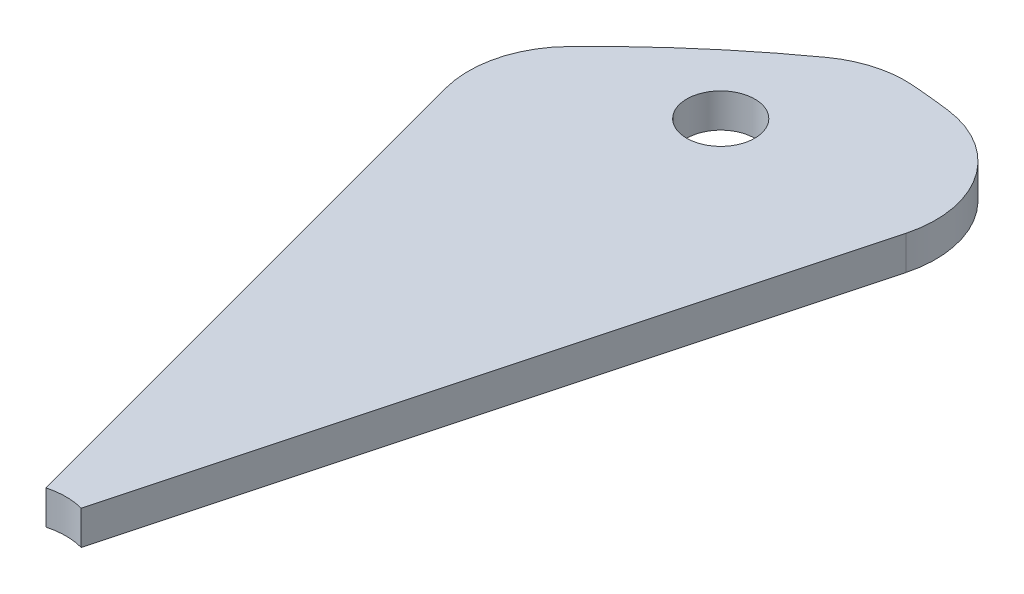
ISO-10303-21;
HEADER;
FILE_DESCRIPTION(('STEP AP214'),'2;1');
FILE_NAME('part.step','',(''),(''),'','','');
FILE_SCHEMA(('AUTOMOTIVE_DESIGN { 1 0 10303 214 1 1 1 1 }'));
ENDSEC;
DATA;
#1=APPLICATION_CONTEXT('core data for automotive mechanical design processes');
#2=APPLICATION_PROTOCOL_DEFINITION('international standard','automotive_design',2000,#1);
#3=PRODUCT_CONTEXT('',#1,'mechanical');
#4=PRODUCT('Part','Part','',(#3));
#5=PRODUCT_RELATED_PRODUCT_CATEGORY('part','',(#4));
#6=PRODUCT_DEFINITION_FORMATION('','',#4);
#7=PRODUCT_DEFINITION_CONTEXT('part definition',#1,'design');
#8=PRODUCT_DEFINITION('design','',#6,#7);
#9=PRODUCT_DEFINITION_SHAPE('','',#8);
#10=(LENGTH_UNIT() NAMED_UNIT(*) SI_UNIT(.MILLI.,.METRE.));
#11=(NAMED_UNIT(*) PLANE_ANGLE_UNIT() SI_UNIT($,.RADIAN.));
#12=(NAMED_UNIT(*) SI_UNIT($,.STERADIAN.) SOLID_ANGLE_UNIT());
#13=UNCERTAINTY_MEASURE_WITH_UNIT(LENGTH_MEASURE(1.E-05),#10,'distance_accuracy_value','');
#14=(GEOMETRIC_REPRESENTATION_CONTEXT(3) GLOBAL_UNCERTAINTY_ASSIGNED_CONTEXT((#13)) GLOBAL_UNIT_ASSIGNED_CONTEXT((#10,
#11,#12)) REPRESENTATION_CONTEXT('',''));
#15=CARTESIAN_POINT('',(0.,0.,0.));
#16=DIRECTION('',(0.,0.,1.));
#17=DIRECTION('',(1.,0.,0.));
#18=AXIS2_PLACEMENT_3D('',#15,#16,#17);
#19=CARTESIAN_POINT('',(0.,0.,0.));
#20=DIRECTION('',(0.,1.,0.));
#21=DIRECTION('',(0.,0.,1.));
#22=AXIS2_PLACEMENT_3D('',#19,#20,#21);
#23=PLANE('',#22);
#24=CARTESIAN_POINT('',(0.,0.,0.));
#25=DIRECTION('',(0.,1.,0.));
#26=DIRECTION('',(0.,0.,1.));
#27=AXIS2_PLACEMENT_3D('',#24,#25,#26);
#28=CIRCLE('',#27,50.);
#29=CARTESIAN_POINT('',(6.23421098286529,0.,-49.6098237592226));
#30=VERTEX_POINT('',#29);
#31=CARTESIAN_POINT('',(3.97727272727275,0.,-49.8415619905004));
#32=VERTEX_POINT('',#31);
#33=EDGE_CURVE('E184',#30,#32,#28,.T.);
#34=ORIENTED_EDGE('',*,*,#33,.F.);
#35=CARTESIAN_POINT('',(5.48610566492146,0.,-43.6566449081159));
#36=DIRECTION('',(0.,1.,0.));
#37=DIRECTION('',(0.,0.,1.));
#38=AXIS2_PLACEMENT_3D('',#35,#36,#37);
#39=CIRCLE('',#38,6.);
#40=CARTESIAN_POINT('',(11.2816606226559,0.,-42.1037306375007));
#41=VERTEX_POINT('',#40);
#42=EDGE_CURVE('E201',#30,#41,#39,.F.);
#43=ORIENTED_EDGE('',*,*,#42,.T.);
#44=DIRECTION('',(0.258819045102521,0.,-0.965925826289068));
#45=VECTOR('',#44,1.);
#46=CARTESIAN_POINT('',(0.,0.,0.));
#47=LINE('',#46,#45);
#48=CARTESIAN_POINT('',(1.03527618041009,0.,-3.86370330515627));
#49=VERTEX_POINT('',#48);
#50=EDGE_CURVE('E181',#49,#41,#47,.T.);
#51=ORIENTED_EDGE('',*,*,#50,.F.);
#52=CARTESIAN_POINT('',(0.,0.,0.));
#53=DIRECTION('',(0.,1.,0.));
#54=DIRECTION('',(0.,0.,1.));
#55=AXIS2_PLACEMENT_3D('',#52,#53,#54);
#56=CIRCLE('',#55,4.);
#57=CARTESIAN_POINT('',(-1.03527618041009,0.,-3.86370330515627));
#58=VERTEX_POINT('',#57);
#59=EDGE_CURVE('E178',#49,#58,#56,.T.);
#60=ORIENTED_EDGE('',*,*,#59,.T.);
#61=DIRECTION('',(-0.258819045102521,0.,-0.965925826289068));
#62=VECTOR('',#61,1.);
#63=CARTESIAN_POINT('',(0.,0.,0.));
#64=LINE('',#63,#62);
#65=CARTESIAN_POINT('',(-9.63613395733424,0.,-35.9625415173111));
#66=VERTEX_POINT('',#65);
#67=EDGE_CURVE('E163',#58,#66,#64,.T.);
#68=ORIENTED_EDGE('',*,*,#67,.T.);
#69=CARTESIAN_POINT('',(-3.84057899959983,0.,-37.5154557879262));
#70=DIRECTION('',(0.,1.,0.));
#71=DIRECTION('',(0.,0.,1.));
#72=AXIS2_PLACEMENT_3D('',#69,#70,#71);
#73=CIRCLE('',#72,6.);
#74=CARTESIAN_POINT('',(-8.15619888844427,0.,-41.6838397643624));
#75=VERTEX_POINT('',#74);
#76=EDGE_CURVE('E197',#66,#75,#73,.F.);
#77=ORIENTED_EDGE('',*,*,#76,.T.);
#78=CARTESIAN_POINT('',(35.,0.,0.));
#79=DIRECTION('',(0.,1.,0.));
#80=DIRECTION('',(0.,0.,1.));
#81=AXIS2_PLACEMENT_3D('',#78,#79,#80);
#82=CIRCLE('',#81,60.);
#83=CARTESIAN_POINT('',(0.,0.,-48.7339717240448));
#84=VERTEX_POINT('',#83);
#85=EDGE_CURVE('E150',#84,#75,#82,.T.);
#86=ORIENTED_EDGE('',*,*,#85,.F.);
#87=CARTESIAN_POINT('',(3.50000000000002,0.,-43.8605745516403));
#88=DIRECTION('',(0.,1.,0.));
#89=DIRECTION('',(0.,0.,1.));
#90=AXIS2_PLACEMENT_3D('',#87,#88,#89);
#91=CIRCLE('',#90,6.);
#92=EDGE_CURVE('E199',#84,#32,#91,.F.);
#93=ORIENTED_EDGE('',*,*,#92,.T.);
#94=EDGE_LOOP('',(#34,#43,#51,#60,#68,#77,#86,#93));
#95=FACE_BOUND('',#94,.T.);
#96=CARTESIAN_POINT('',(0.,0.,-42.5));
#97=DIRECTION('',(0.,1.,0.));
#98=DIRECTION('',(0.,0.,1.));
#99=AXIS2_PLACEMENT_3D('',#96,#97,#98);
#100=CIRCLE('',#99,2.);
#101=CARTESIAN_POINT('',(0.,0.,-40.5));
#102=VERTEX_POINT('',#101);
#103=EDGE_CURVE('E157',#102,#102,#100,.T.);
#104=ORIENTED_EDGE('',*,*,#103,.T.);
#105=EDGE_LOOP('',(#104));
#106=FACE_BOUND('',#105,.T.);
#107=CARTESIAN_POINT('',(-1.5,0.,-38.));
#108=DIRECTION('',(0.,-1.,0.));
#109=DIRECTION('',(0.,0.,-1.));
#110=AXIS2_PLACEMENT_3D('',#107,#108,#109);
#111=CIRCLE('',#110,0.5);
#112=CARTESIAN_POINT('',(-1.5,0.,-37.5));
#113=VERTEX_POINT('',#112);
#114=CARTESIAN_POINT('',(-1.5,0.,-38.5));
#115=VERTEX_POINT('',#114);
#116=EDGE_CURVE('E146',#113,#115,#111,.T.);
#117=ORIENTED_EDGE('',*,*,#116,.F.);
#118=DIRECTION('',(-1.,0.,0.));
#119=VECTOR('',#118,1.);
#120=CARTESIAN_POINT('',(-1.5,0.,-37.5));
#121=LINE('',#120,#119);
#122=CARTESIAN_POINT('',(1.5,0.,-37.5));
#123=VERTEX_POINT('',#122);
#124=EDGE_CURVE('E143',#123,#113,#121,.T.);
#125=ORIENTED_EDGE('',*,*,#124,.F.);
#126=CARTESIAN_POINT('',(1.5,0.,-38.));
#127=DIRECTION('',(0.,-1.,0.));
#128=DIRECTION('',(0.,0.,-1.));
#129=AXIS2_PLACEMENT_3D('',#126,#127,#128);
#130=CIRCLE('',#129,0.5);
#131=CARTESIAN_POINT('',(1.5,0.,-38.5));
#132=VERTEX_POINT('',#131);
#133=EDGE_CURVE('E57',#132,#123,#130,.T.);
#134=ORIENTED_EDGE('',*,*,#133,.F.);
#135=DIRECTION('',(1.,0.,0.));
#136=VECTOR('',#135,1.);
#137=CARTESIAN_POINT('',(-1.5,0.,-38.5));
#138=LINE('',#137,#136);
#139=EDGE_CURVE('E52',#115,#132,#138,.T.);
#140=ORIENTED_EDGE('',*,*,#139,.F.);
#141=EDGE_LOOP('',(#117,#125,#134,#140));
#142=FACE_BOUND('',#141,.T.);
#143=ADVANCED_FACE('F37',(#95,#106,#142),#23,.F.);
#144=CARTESIAN_POINT('',(0.,2.,0.));
#145=DIRECTION('',(0.,-1.,0.));
#146=DIRECTION('',(0.,0.,-1.));
#147=AXIS2_PLACEMENT_3D('',#144,#145,#146);
#148=CYLINDRICAL_SURFACE('',#147,50.);
#149=CARTESIAN_POINT('',(0.,2.,0.));
#150=DIRECTION('',(0.,1.,0.));
#151=DIRECTION('',(0.,0.,1.));
#152=AXIS2_PLACEMENT_3D('',#149,#150,#151);
#153=CIRCLE('',#152,50.);
#154=CARTESIAN_POINT('',(6.23421098286529,2.,-49.6098237592226));
#155=VERTEX_POINT('',#154);
#156=CARTESIAN_POINT('',(3.97727272727275,2.,-49.8415619905004));
#157=VERTEX_POINT('',#156);
#158=EDGE_CURVE('E169',#155,#157,#153,.T.);
#159=ORIENTED_EDGE('',*,*,#158,.F.);
#160=DIRECTION('',(0.,-1.,0.));
#161=VECTOR('',#160,1.);
#162=CARTESIAN_POINT('',(6.23421098286529,2.,-49.6098237592226));
#163=LINE('',#162,#161);
#164=EDGE_CURVE('E194',#155,#30,#163,.T.);
#165=ORIENTED_EDGE('',*,*,#164,.T.);
#166=ORIENTED_EDGE('',*,*,#33,.T.);
#167=DIRECTION('',(0.,-1.,0.));
#168=VECTOR('',#167,1.);
#169=CARTESIAN_POINT('',(3.97727272727275,2.,-49.8415619905004));
#170=LINE('',#169,#168);
#171=EDGE_CURVE('E192',#32,#157,#170,.F.);
#172=ORIENTED_EDGE('',*,*,#171,.T.);
#173=EDGE_LOOP('',(#159,#165,#166,#172));
#174=FACE_BOUND('',#173,.T.);
#175=ADVANCED_FACE('F238',(#174),#148,.T.);
#176=CARTESIAN_POINT('',(0.,2.,0.));
#177=DIRECTION('',(-0.965925826289068,0.,0.258819045102521));
#178=DIRECTION('',(0.258819045102521,0.,0.965925826289068));
#179=AXIS2_PLACEMENT_3D('',#176,#177,#178);
#180=PLANE('',#179);
#181=DIRECTION('',(-0.258819045102521,0.,-0.965925826289068));
#182=VECTOR('',#181,1.);
#183=CARTESIAN_POINT('',(0.,2.,0.));
#184=LINE('',#183,#182);
#185=CARTESIAN_POINT('',(-1.03527618041009,2.,-3.86370330515627));
#186=VERTEX_POINT('',#185);
#187=CARTESIAN_POINT('',(-9.63613395733424,2.,-35.9625415173111));
#188=VERTEX_POINT('',#187);
#189=EDGE_CURVE('E172',#186,#188,#184,.T.);
#190=ORIENTED_EDGE('',*,*,#189,.T.);
#191=DIRECTION('',(0.,1.,0.));
#192=VECTOR('',#191,1.);
#193=CARTESIAN_POINT('',(-9.63613395733424,2.,-35.962541517311));
#194=LINE('',#193,#192);
#195=EDGE_CURVE('E12',#188,#66,#194,.F.);
#196=ORIENTED_EDGE('',*,*,#195,.T.);
#197=ORIENTED_EDGE('',*,*,#67,.F.);
#198=DIRECTION('',(0.,-1.,0.));
#199=VECTOR('',#198,1.);
#200=CARTESIAN_POINT('',(-1.03527618041009,2.,-3.86370330515627));
#201=LINE('',#200,#199);
#202=EDGE_CURVE('E175',#186,#58,#201,.T.);
#203=ORIENTED_EDGE('',*,*,#202,.F.);
#204=EDGE_LOOP('',(#190,#196,#197,#203));
#205=FACE_BOUND('',#204,.T.);
#206=ADVANCED_FACE('F229',(#205),#180,.T.);
#207=CARTESIAN_POINT('',(0.,2.,0.));
#208=DIRECTION('',(0.,1.,0.));
#209=DIRECTION('',(0.,0.,1.));
#210=AXIS2_PLACEMENT_3D('',#207,#208,#209);
#211=PLANE('',#210);
#212=CARTESIAN_POINT('',(0.,2.,-42.5));
#213=DIRECTION('',(0.,1.,0.));
#214=DIRECTION('',(0.,0.,1.));
#215=AXIS2_PLACEMENT_3D('',#212,#213,#214);
#216=CIRCLE('',#215,2.);
#217=CARTESIAN_POINT('',(0.,2.,-40.5));
#218=VERTEX_POINT('',#217);
#219=EDGE_CURVE('E159',#218,#218,#216,.T.);
#220=ORIENTED_EDGE('',*,*,#219,.F.);
#221=EDGE_LOOP('',(#220));
#222=FACE_BOUND('',#221,.T.);
#223=DIRECTION('',(0.258819045102521,0.,-0.965925826289068));
#224=VECTOR('',#223,1.);
#225=CARTESIAN_POINT('',(0.,2.,0.));
#226=LINE('',#225,#224);
#227=CARTESIAN_POINT('',(1.03527618041009,2.,-3.86370330515627));
#228=VERTEX_POINT('',#227);
#229=CARTESIAN_POINT('',(11.2816606226559,2.,-42.1037306375007));
#230=VERTEX_POINT('',#229);
#231=EDGE_CURVE('E166',#228,#230,#226,.T.);
#232=ORIENTED_EDGE('',*,*,#231,.T.);
#233=CARTESIAN_POINT('',(5.48610566492146,2.,-43.6566449081159));
#234=DIRECTION('',(0.,1.,0.));
#235=DIRECTION('',(0.,0.,1.));
#236=AXIS2_PLACEMENT_3D('',#233,#234,#235);
#237=CIRCLE('',#236,6.);
#238=EDGE_CURVE('E209',#230,#155,#237,.T.);
#239=ORIENTED_EDGE('',*,*,#238,.T.);
#240=ORIENTED_EDGE('',*,*,#158,.T.);
#241=CARTESIAN_POINT('',(3.50000000000002,2.,-43.8605745516403));
#242=DIRECTION('',(0.,1.,0.));
#243=DIRECTION('',(0.,0.,1.));
#244=AXIS2_PLACEMENT_3D('',#241,#242,#243);
#245=CIRCLE('',#244,6.);
#246=CARTESIAN_POINT('',(0.,2.,-48.7339717240448));
#247=VERTEX_POINT('',#246);
#248=EDGE_CURVE('E207',#157,#247,#245,.T.);
#249=ORIENTED_EDGE('',*,*,#248,.T.);
#250=CARTESIAN_POINT('',(35.,2.,0.));
#251=DIRECTION('',(0.,1.,0.));
#252=DIRECTION('',(0.,0.,1.));
#253=AXIS2_PLACEMENT_3D('',#250,#251,#252);
#254=CIRCLE('',#253,60.);
#255=CARTESIAN_POINT('',(-8.15619888844427,2.,-41.6838397643624));
#256=VERTEX_POINT('',#255);
#257=EDGE_CURVE('E147',#247,#256,#254,.T.);
#258=ORIENTED_EDGE('',*,*,#257,.T.);
#259=CARTESIAN_POINT('',(-3.84057899959983,2.,-37.5154557879262));
#260=DIRECTION('',(0.,1.,0.));
#261=DIRECTION('',(0.,0.,1.));
#262=AXIS2_PLACEMENT_3D('',#259,#260,#261);
#263=CIRCLE('',#262,6.);
#264=EDGE_CURVE('E205',#256,#188,#263,.T.);
#265=ORIENTED_EDGE('',*,*,#264,.T.);
#266=ORIENTED_EDGE('',*,*,#189,.F.);
#267=CARTESIAN_POINT('',(0.,2.,0.));
#268=DIRECTION('',(0.,1.,0.));
#269=DIRECTION('',(0.,0.,1.));
#270=AXIS2_PLACEMENT_3D('',#267,#268,#269);
#271=CIRCLE('',#270,4.);
#272=EDGE_CURVE('E162',#228,#186,#271,.T.);
#273=ORIENTED_EDGE('',*,*,#272,.F.);
#274=EDGE_LOOP('',(#232,#239,#240,#249,#258,#265,#266,#273));
#275=FACE_BOUND('',#274,.T.);
#276=ADVANCED_FACE('F233',(#222,#275),#211,.T.);
#277=CARTESIAN_POINT('',(0.,2.,0.));
#278=DIRECTION('',(0.,-1.,0.));
#279=DIRECTION('',(0.,0.,-1.));
#280=AXIS2_PLACEMENT_3D('',#277,#278,#279);
#281=CYLINDRICAL_SURFACE('',#280,4.);
#282=ORIENTED_EDGE('',*,*,#59,.F.);
#283=DIRECTION('',(0.,-1.,0.));
#284=VECTOR('',#283,1.);
#285=CARTESIAN_POINT('',(1.03527618041009,2.,-3.86370330515627));
#286=LINE('',#285,#284);
#287=EDGE_CURVE('E190',#228,#49,#286,.T.);
#288=ORIENTED_EDGE('',*,*,#287,.F.);
#289=ORIENTED_EDGE('',*,*,#272,.T.);
#290=ORIENTED_EDGE('',*,*,#202,.T.);
#291=EDGE_LOOP('',(#282,#288,#289,#290));
#292=FACE_BOUND('',#291,.T.);
#293=ADVANCED_FACE('F270',(#292),#281,.F.);
#294=CARTESIAN_POINT('',(0.,2.,0.));
#295=DIRECTION('',(-0.965925826289068,0.,-0.258819045102521));
#296=DIRECTION('',(-0.258819045102521,0.,0.965925826289068));
#297=AXIS2_PLACEMENT_3D('',#294,#295,#296);
#298=PLANE('',#297);
#299=ORIENTED_EDGE('',*,*,#50,.T.);
#300=DIRECTION('',(0.,-1.,0.));
#301=VECTOR('',#300,1.);
#302=CARTESIAN_POINT('',(11.2816606226559,2.,-42.1037306375007));
#303=LINE('',#302,#301);
#304=EDGE_CURVE('E203',#41,#230,#303,.F.);
#305=ORIENTED_EDGE('',*,*,#304,.T.);
#306=ORIENTED_EDGE('',*,*,#231,.F.);
#307=ORIENTED_EDGE('',*,*,#287,.T.);
#308=EDGE_LOOP('',(#299,#305,#306,#307));
#309=FACE_BOUND('',#308,.T.);
#310=ADVANCED_FACE('F245',(#309),#298,.F.);
#311=CARTESIAN_POINT('',(0.,2.,-42.5));
#312=DIRECTION('',(0.,-1.,0.));
#313=DIRECTION('',(0.,0.,-1.));
#314=AXIS2_PLACEMENT_3D('',#311,#312,#313);
#315=CYLINDRICAL_SURFACE('',#314,2.);
#316=ORIENTED_EDGE('',*,*,#219,.T.);
#317=EDGE_LOOP('',(#316));
#318=FACE_BOUND('',#317,.T.);
#319=ORIENTED_EDGE('',*,*,#103,.F.);
#320=EDGE_LOOP('',(#319));
#321=FACE_BOUND('',#320,.T.);
#322=ADVANCED_FACE('F255',(#318,#321),#315,.F.);
#323=CARTESIAN_POINT('',(35.,0.,0.));
#324=DIRECTION('',(0.,1.,0.));
#325=DIRECTION('',(0.,0.,1.));
#326=AXIS2_PLACEMENT_3D('',#323,#324,#325);
#327=CYLINDRICAL_SURFACE('',#326,60.);
#328=ORIENTED_EDGE('',*,*,#257,.F.);
#329=DIRECTION('',(0.,1.,0.));
#330=VECTOR('',#329,1.);
#331=CARTESIAN_POINT('',(0.,0.,-48.7339717240448));
#332=LINE('',#331,#330);
#333=EDGE_CURVE('E45',#247,#84,#332,.F.);
#334=ORIENTED_EDGE('',*,*,#333,.T.);
#335=ORIENTED_EDGE('',*,*,#85,.T.);
#336=DIRECTION('',(0.,1.,0.));
#337=VECTOR('',#336,1.);
#338=CARTESIAN_POINT('',(-8.15619888844426,0.,-41.6838397643624));
#339=LINE('',#338,#337);
#340=EDGE_CURVE('E211',#75,#256,#339,.T.);
#341=ORIENTED_EDGE('',*,*,#340,.T.);
#342=EDGE_LOOP('',(#328,#334,#335,#341));
#343=FACE_BOUND('',#342,.T.);
#344=ADVANCED_FACE('F217',(#343),#327,.T.);
#345=CARTESIAN_POINT('',(5.48610566492146,2.,-43.6566449081159));
#346=DIRECTION('',(0.,-1.,0.));
#347=DIRECTION('',(0.,0.,-1.));
#348=AXIS2_PLACEMENT_3D('',#345,#346,#347);
#349=CYLINDRICAL_SURFACE('',#348,6.);
#350=ORIENTED_EDGE('',*,*,#238,.F.);
#351=ORIENTED_EDGE('',*,*,#304,.F.);
#352=ORIENTED_EDGE('',*,*,#42,.F.);
#353=ORIENTED_EDGE('',*,*,#164,.F.);
#354=EDGE_LOOP('',(#350,#351,#352,#353));
#355=FACE_BOUND('',#354,.T.);
#356=ADVANCED_FACE('F248',(#355),#349,.T.);
#357=CARTESIAN_POINT('',(3.50000000000002,2.,-43.8605745516403));
#358=DIRECTION('',(0.,-1.,0.));
#359=DIRECTION('',(0.,0.,-1.));
#360=AXIS2_PLACEMENT_3D('',#357,#358,#359);
#361=CYLINDRICAL_SURFACE('',#360,6.);
#362=ORIENTED_EDGE('',*,*,#248,.F.);
#363=ORIENTED_EDGE('',*,*,#171,.F.);
#364=ORIENTED_EDGE('',*,*,#92,.F.);
#365=ORIENTED_EDGE('',*,*,#333,.F.);
#366=EDGE_LOOP('',(#362,#363,#364,#365));
#367=FACE_BOUND('',#366,.T.);
#368=ADVANCED_FACE('F236',(#367),#361,.T.);
#369=CARTESIAN_POINT('',(-3.84057899959983,0.,-37.5154557879262));
#370=DIRECTION('',(0.,1.,0.));
#371=DIRECTION('',(0.,0.,1.));
#372=AXIS2_PLACEMENT_3D('',#369,#370,#371);
#373=CYLINDRICAL_SURFACE('',#372,6.);
#374=ORIENTED_EDGE('',*,*,#264,.F.);
#375=ORIENTED_EDGE('',*,*,#340,.F.);
#376=ORIENTED_EDGE('',*,*,#76,.F.);
#377=ORIENTED_EDGE('',*,*,#195,.F.);
#378=EDGE_LOOP('',(#374,#375,#376,#377));
#379=FACE_BOUND('',#378,.T.);
#380=ADVANCED_FACE('F39',(#379),#373,.T.);
#381=CARTESIAN_POINT('',(-1.5,-1.,-38.));
#382=DIRECTION('',(0.,1.,0.));
#383=DIRECTION('',(0.,0.,1.));
#384=AXIS2_PLACEMENT_3D('',#381,#382,#383);
#385=CYLINDRICAL_SURFACE('',#384,0.5);
#386=ORIENTED_EDGE('',*,*,#116,.T.);
#387=DIRECTION('',(0.,1.,0.));
#388=VECTOR('',#387,1.);
#389=CARTESIAN_POINT('',(-1.5,-1.,-38.5));
#390=LINE('',#389,#388);
#391=CARTESIAN_POINT('',(-1.5,-1.,-38.5));
#392=VERTEX_POINT('',#391);
#393=EDGE_CURVE('E127',#392,#115,#390,.T.);
#394=ORIENTED_EDGE('',*,*,#393,.F.);
#395=CARTESIAN_POINT('',(-1.5,-1.,-38.));
#396=DIRECTION('',(0.,-1.,0.));
#397=DIRECTION('',(0.,0.,-1.));
#398=AXIS2_PLACEMENT_3D('',#395,#396,#397);
#399=CIRCLE('',#398,0.5);
#400=CARTESIAN_POINT('',(-1.5,-1.,-37.5));
#401=VERTEX_POINT('',#400);
#402=EDGE_CURVE('E134',#401,#392,#399,.T.);
#403=ORIENTED_EDGE('',*,*,#402,.F.);
#404=DIRECTION('',(0.,1.,0.));
#405=VECTOR('',#404,1.);
#406=CARTESIAN_POINT('',(-1.5,-1.,-37.5));
#407=LINE('',#406,#405);
#408=EDGE_CURVE('E285',#401,#113,#407,.T.);
#409=ORIENTED_EDGE('',*,*,#408,.T.);
#410=EDGE_LOOP('',(#386,#394,#403,#409));
#411=FACE_BOUND('',#410,.T.);
#412=ADVANCED_FACE('F145',(#411),#385,.T.);
#413=CARTESIAN_POINT('',(-1.5,-1.,-38.5));
#414=DIRECTION('',(0.,0.,1.));
#415=DIRECTION('',(1.,0.,0.));
#416=AXIS2_PLACEMENT_3D('',#413,#414,#415);
#417=PLANE('',#416);
#418=ORIENTED_EDGE('',*,*,#139,.T.);
#419=DIRECTION('',(0.,1.,0.));
#420=VECTOR('',#419,1.);
#421=CARTESIAN_POINT('',(1.5,-1.,-38.5));
#422=LINE('',#421,#420);
#423=CARTESIAN_POINT('',(1.5,-1.,-38.5));
#424=VERTEX_POINT('',#423);
#425=EDGE_CURVE('E130',#424,#132,#422,.T.);
#426=ORIENTED_EDGE('',*,*,#425,.F.);
#427=DIRECTION('',(1.,0.,0.));
#428=VECTOR('',#427,1.);
#429=CARTESIAN_POINT('',(-1.5,-1.,-38.5));
#430=LINE('',#429,#428);
#431=EDGE_CURVE('E123',#392,#424,#430,.T.);
#432=ORIENTED_EDGE('',*,*,#431,.F.);
#433=ORIENTED_EDGE('',*,*,#393,.T.);
#434=EDGE_LOOP('',(#418,#426,#432,#433));
#435=FACE_BOUND('',#434,.T.);
#436=ADVANCED_FACE('F125',(#435),#417,.F.);
#437=CARTESIAN_POINT('',(1.5,-1.,-38.));
#438=DIRECTION('',(0.,1.,0.));
#439=DIRECTION('',(0.,0.,1.));
#440=AXIS2_PLACEMENT_3D('',#437,#438,#439);
#441=CYLINDRICAL_SURFACE('',#440,0.5);
#442=ORIENTED_EDGE('',*,*,#133,.T.);
#443=DIRECTION('',(0.,1.,0.));
#444=VECTOR('',#443,1.);
#445=CARTESIAN_POINT('',(1.5,-1.,-37.5));
#446=LINE('',#445,#444);
#447=CARTESIAN_POINT('',(1.5,-1.,-37.5));
#448=VERTEX_POINT('',#447);
#449=EDGE_CURVE('E152',#448,#123,#446,.T.);
#450=ORIENTED_EDGE('',*,*,#449,.F.);
#451=CARTESIAN_POINT('',(1.5,-1.,-38.));
#452=DIRECTION('',(0.,-1.,0.));
#453=DIRECTION('',(0.,0.,-1.));
#454=AXIS2_PLACEMENT_3D('',#451,#452,#453);
#455=CIRCLE('',#454,0.5);
#456=EDGE_CURVE('E133',#424,#448,#455,.T.);
#457=ORIENTED_EDGE('',*,*,#456,.F.);
#458=ORIENTED_EDGE('',*,*,#425,.T.);
#459=EDGE_LOOP('',(#442,#450,#457,#458));
#460=FACE_BOUND('',#459,.T.);
#461=ADVANCED_FACE('F294',(#460),#441,.T.);
#462=CARTESIAN_POINT('',(-1.5,-1.,-37.5));
#463=DIRECTION('',(0.,0.,-1.));
#464=DIRECTION('',(-1.,0.,0.));
#465=AXIS2_PLACEMENT_3D('',#462,#463,#464);
#466=PLANE('',#465);
#467=ORIENTED_EDGE('',*,*,#124,.T.);
#468=ORIENTED_EDGE('',*,*,#408,.F.);
#469=DIRECTION('',(-1.,0.,0.));
#470=VECTOR('',#469,1.);
#471=CARTESIAN_POINT('',(-1.5,-1.,-37.5));
#472=LINE('',#471,#470);
#473=EDGE_CURVE('E139',#448,#401,#472,.T.);
#474=ORIENTED_EDGE('',*,*,#473,.F.);
#475=ORIENTED_EDGE('',*,*,#449,.T.);
#476=EDGE_LOOP('',(#467,#468,#474,#475));
#477=FACE_BOUND('',#476,.T.);
#478=ADVANCED_FACE('F284',(#477),#466,.F.);
#479=CARTESIAN_POINT('',(-1.5,-1.,-38.));
#480=DIRECTION('',(0.,-1.,0.));
#481=DIRECTION('',(0.,0.,-1.));
#482=AXIS2_PLACEMENT_3D('',#479,#480,#481);
#483=PLANE('',#482);
#484=ORIENTED_EDGE('',*,*,#402,.T.);
#485=ORIENTED_EDGE('',*,*,#431,.T.);
#486=ORIENTED_EDGE('',*,*,#456,.T.);
#487=ORIENTED_EDGE('',*,*,#473,.T.);
#488=EDGE_LOOP('',(#484,#485,#486,#487));
#489=FACE_BOUND('',#488,.T.);
#490=ADVANCED_FACE('F137',(#489),#483,.T.);
#491=CLOSED_SHELL('',(#143,#175,#206,#276,#293,#310,#322,#344,#356,#368,#380,#412,#436,#461,
#478,#490));
#492=MANIFOLD_SOLID_BREP('B2',#491);
#493=ADVANCED_BREP_SHAPE_REPRESENTATION('',(#18,#492),#14);
#494=SHAPE_DEFINITION_REPRESENTATION(#9,#493);
ENDSEC;
END-ISO-10303-21;
